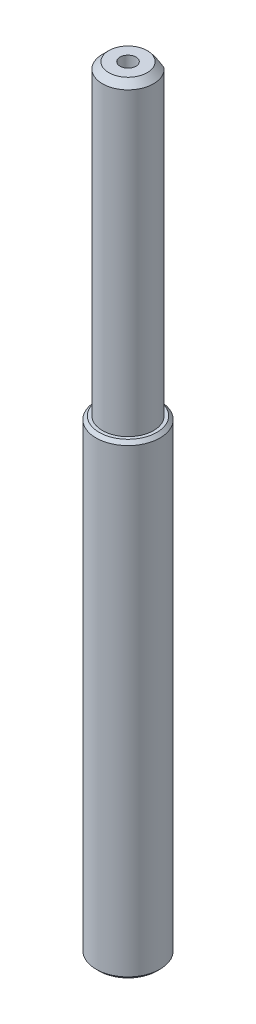
ISO-10303-21;
HEADER;
FILE_DESCRIPTION(('STEP AP214'),'2;1');
FILE_NAME('part.step','',(''),(''),'','','');
FILE_SCHEMA(('AUTOMOTIVE_DESIGN { 1 0 10303 214 1 1 1 1 }'));
ENDSEC;
DATA;
#1=APPLICATION_CONTEXT('core data for automotive mechanical design processes');
#2=APPLICATION_PROTOCOL_DEFINITION('international standard','automotive_design',2000,#1);
#3=PRODUCT_CONTEXT('',#1,'mechanical');
#4=PRODUCT('Part','Part','',(#3));
#5=PRODUCT_RELATED_PRODUCT_CATEGORY('part','',(#4));
#6=PRODUCT_DEFINITION_FORMATION('','',#4);
#7=PRODUCT_DEFINITION_CONTEXT('part definition',#1,'design');
#8=PRODUCT_DEFINITION('design','',#6,#7);
#9=PRODUCT_DEFINITION_SHAPE('','',#8);
#10=(LENGTH_UNIT() NAMED_UNIT(*) SI_UNIT(.MILLI.,.METRE.));
#11=(NAMED_UNIT(*) PLANE_ANGLE_UNIT() SI_UNIT($,.RADIAN.));
#12=(NAMED_UNIT(*) SI_UNIT($,.STERADIAN.) SOLID_ANGLE_UNIT());
#13=UNCERTAINTY_MEASURE_WITH_UNIT(LENGTH_MEASURE(1.E-05),#10,'distance_accuracy_value','');
#14=(GEOMETRIC_REPRESENTATION_CONTEXT(3) GLOBAL_UNCERTAINTY_ASSIGNED_CONTEXT((#13)) GLOBAL_UNIT_ASSIGNED_CONTEXT((#10,
#11,#12)) REPRESENTATION_CONTEXT('',''));
#15=CARTESIAN_POINT('',(0.,0.,0.));
#16=DIRECTION('',(0.,0.,1.));
#17=DIRECTION('',(1.,0.,0.));
#18=AXIS2_PLACEMENT_3D('',#15,#16,#17);
#19=CARTESIAN_POINT('',(0.,24.,0.));
#20=DIRECTION('',(0.,-1.,0.));
#21=DIRECTION('',(0.,0.,-1.));
#22=AXIS2_PLACEMENT_3D('',#19,#20,#21);
#23=CYLINDRICAL_SURFACE('',#22,2.);
#24=CARTESIAN_POINT('',(0.,23.5,0.));
#25=DIRECTION('',(0.,1.,0.));
#26=DIRECTION('',(0.,0.,1.));
#27=AXIS2_PLACEMENT_3D('',#24,#25,#26);
#28=CIRCLE('',#27,2.);
#29=CARTESIAN_POINT('',(1.3228756555323,23.5,-1.5));
#30=VERTEX_POINT('',#29);
#31=CARTESIAN_POINT('',(-1.3228756555323,23.5,-1.5));
#32=VERTEX_POINT('',#31);
#33=EDGE_CURVE('E83',#30,#32,#28,.F.);
#34=ORIENTED_EDGE('',*,*,#33,.T.);
#35=DIRECTION('',(0.,1.,0.));
#36=VECTOR('',#35,1.);
#37=CARTESIAN_POINT('',(-1.3228756555323,9.,-1.5));
#38=LINE('',#37,#36);
#39=CARTESIAN_POINT('',(-1.3228756555323,9.,-1.5));
#40=VERTEX_POINT('',#39);
#41=EDGE_CURVE('E77',#40,#32,#38,.T.);
#42=ORIENTED_EDGE('',*,*,#41,.F.);
#43=CARTESIAN_POINT('',(0.,9.,0.));
#44=DIRECTION('',(0.,1.,0.));
#45=DIRECTION('',(0.,0.,1.));
#46=AXIS2_PLACEMENT_3D('',#43,#44,#45);
#47=CIRCLE('',#46,2.);
#48=CARTESIAN_POINT('',(1.3228756555323,9.,-1.5));
#49=VERTEX_POINT('',#48);
#50=EDGE_CURVE('E68',#49,#40,#47,.T.);
#51=ORIENTED_EDGE('',*,*,#50,.F.);
#52=DIRECTION('',(0.,1.,0.));
#53=VECTOR('',#52,1.);
#54=CARTESIAN_POINT('',(1.3228756555323,9.,-1.5));
#55=LINE('',#54,#53);
#56=EDGE_CURVE('E78',#49,#30,#55,.T.);
#57=ORIENTED_EDGE('',*,*,#56,.T.);
#58=EDGE_LOOP('',(#34,#42,#51,#57));
#59=FACE_BOUND('',#58,.T.);
#60=CARTESIAN_POINT('',(0.,0.,0.));
#61=DIRECTION('',(0.,-1.,0.));
#62=DIRECTION('',(0.,0.,-1.));
#63=AXIS2_PLACEMENT_3D('',#60,#61,#62);
#64=CIRCLE('',#63,2.);
#65=CARTESIAN_POINT('',(0.,0.,-2.));
#66=VERTEX_POINT('',#65);
#67=EDGE_CURVE('E93',#66,#66,#64,.T.);
#68=ORIENTED_EDGE('',*,*,#67,.F.);
#69=EDGE_LOOP('',(#68));
#70=FACE_BOUND('',#69,.T.);
#71=ADVANCED_FACE('F36',(#59,#70),#23,.T.);
#72=CARTESIAN_POINT('',(0.,24.,0.));
#73=DIRECTION('',(0.,1.,0.));
#74=DIRECTION('',(0.,0.,1.));
#75=AXIS2_PLACEMENT_3D('',#72,#73,#74);
#76=PLANE('',#75);
#77=CARTESIAN_POINT('',(0.,24.,0.));
#78=DIRECTION('',(0.,1.,0.));
#79=DIRECTION('',(0.,0.,1.));
#80=AXIS2_PLACEMENT_3D('',#77,#78,#79);
#81=CIRCLE('',#80,0.624999999999995);
#82=CARTESIAN_POINT('',(0.,24.,0.624999999999995));
#83=VERTEX_POINT('',#82);
#84=EDGE_CURVE('E85',#83,#83,#81,.T.);
#85=ORIENTED_EDGE('',*,*,#84,.F.);
#86=EDGE_LOOP('',(#85));
#87=FACE_BOUND('',#86,.T.);
#88=CARTESIAN_POINT('',(0.,24.,0.));
#89=DIRECTION('',(0.,1.,0.));
#90=DIRECTION('',(0.,0.,1.));
#91=AXIS2_PLACEMENT_3D('',#88,#89,#90);
#92=CIRCLE('',#91,1.49999999999999);
#93=CARTESIAN_POINT('',(0.,24.,-1.49999999999999));
#94=VERTEX_POINT('',#93);
#95=EDGE_CURVE('E96',#94,#94,#92,.T.);
#96=ORIENTED_EDGE('',*,*,#95,.T.);
#97=EDGE_LOOP('',(#96));
#98=FACE_BOUND('',#97,.T.);
#99=ADVANCED_FACE('F131',(#87,#98),#76,.T.);
#100=CARTESIAN_POINT('',(0.,0.,0.));
#101=DIRECTION('',(0.,-1.,0.));
#102=DIRECTION('',(0.,0.,-1.));
#103=AXIS2_PLACEMENT_3D('',#100,#101,#102);
#104=PLANE('',#103);
#105=CARTESIAN_POINT('',(0.,0.,0.));
#106=DIRECTION('',(0.,-1.,0.));
#107=DIRECTION('',(0.,0.,-1.));
#108=AXIS2_PLACEMENT_3D('',#105,#106,#107);
#109=CIRCLE('',#108,2.25);
#110=CARTESIAN_POINT('',(0.,0.,-2.25));
#111=VERTEX_POINT('',#110);
#112=EDGE_CURVE('E11',#111,#111,#109,.F.);
#113=ORIENTED_EDGE('',*,*,#112,.T.);
#114=EDGE_LOOP('',(#113));
#115=FACE_BOUND('',#114,.T.);
#116=ORIENTED_EDGE('',*,*,#67,.T.);
#117=EDGE_LOOP('',(#116));
#118=FACE_BOUND('',#117,.T.);
#119=ADVANCED_FACE('F128',(#115,#118),#104,.F.);
#120=CARTESIAN_POINT('',(0.,-36.5,0.));
#121=DIRECTION('',(0.,1.,0.));
#122=DIRECTION('',(0.,0.,1.));
#123=AXIS2_PLACEMENT_3D('',#120,#121,#122);
#124=CYLINDRICAL_SURFACE('',#123,2.5);
#125=CARTESIAN_POINT('',(0.,-36.25,0.));
#126=DIRECTION('',(0.,-1.,0.));
#127=DIRECTION('',(0.,0.,-1.));
#128=AXIS2_PLACEMENT_3D('',#125,#126,#127);
#129=CIRCLE('',#128,2.5);
#130=CARTESIAN_POINT('',(0.,-36.25,-2.5));
#131=VERTEX_POINT('',#130);
#132=EDGE_CURVE('E44',#131,#131,#129,.F.);
#133=ORIENTED_EDGE('',*,*,#132,.T.);
#134=EDGE_LOOP('',(#133));
#135=FACE_BOUND('',#134,.T.);
#136=CARTESIAN_POINT('',(0.,-0.25,0.));
#137=DIRECTION('',(0.,-1.,0.));
#138=DIRECTION('',(0.,0.,-1.));
#139=AXIS2_PLACEMENT_3D('',#136,#137,#138);
#140=CIRCLE('',#139,2.5);
#141=CARTESIAN_POINT('',(0.,-0.25,-2.5));
#142=VERTEX_POINT('',#141);
#143=EDGE_CURVE('E227',#142,#142,#140,.T.);
#144=ORIENTED_EDGE('',*,*,#143,.T.);
#145=EDGE_LOOP('',(#144));
#146=FACE_BOUND('',#145,.T.);
#147=ADVANCED_FACE('F126',(#135,#146),#124,.T.);
#148=CARTESIAN_POINT('',(0.,-36.5,0.));
#149=DIRECTION('',(0.,-1.,0.));
#150=DIRECTION('',(0.,0.,-1.));
#151=AXIS2_PLACEMENT_3D('',#148,#149,#150);
#152=PLANE('',#151);
#153=CARTESIAN_POINT('',(0.,-36.5,0.));
#154=DIRECTION('',(0.,-1.,0.));
#155=DIRECTION('',(0.,0.,-1.));
#156=AXIS2_PLACEMENT_3D('',#153,#154,#155);
#157=CIRCLE('',#156,2.25);
#158=CARTESIAN_POINT('',(0.,-36.5,-2.25));
#159=VERTEX_POINT('',#158);
#160=EDGE_CURVE('E107',#159,#159,#157,.T.);
#161=ORIENTED_EDGE('',*,*,#160,.T.);
#162=EDGE_LOOP('',(#161));
#163=FACE_BOUND('',#162,.T.);
#164=ADVANCED_FACE('F123',(#163),#152,.T.);
#165=CARTESIAN_POINT('',(0.,24.,0.));
#166=DIRECTION('',(0.,-1.,0.));
#167=DIRECTION('',(0.,0.,-1.));
#168=AXIS2_PLACEMENT_3D('',#165,#166,#167);
#169=CONICAL_SURFACE('',#168,1.49999999999999,0.785398163397447);
#170=CARTESIAN_POINT('',(-2.6642770471932,22.4424892176477,-1.5));
#171=CARTESIAN_POINT('',(-2.60054070060768,22.4980177092399,-1.5));
#172=CARTESIAN_POINT('',(-2.53657536633564,22.5532863921102,-1.5));
#173=CARTESIAN_POINT('',(-2.4080636657588,22.6631632147795,-1.5));
#174=CARTESIAN_POINT('',(-2.34351721366277,22.7177712541624,-1.5));
#175=CARTESIAN_POINT('',(-2.21331084345961,22.8265269644548,-1.5));
#176=CARTESIAN_POINT('',(-2.14764638739505,22.8806692149271,-1.5));
#177=CARTESIAN_POINT('',(-2.01547092762352,22.987903519855,-1.5));
#178=CARTESIAN_POINT('',(-1.94895998057567,23.0409956439986,-1.5));
#179=CARTESIAN_POINT('',(-1.80945891275703,23.1500854947049,-1.5));
#180=CARTESIAN_POINT('',(-1.7363802277742,23.2059704093189,-1.5));
#181=CARTESIAN_POINT('',(-1.5886678040126,23.3156432281179,-1.5));
#182=CARTESIAN_POINT('',(-1.51403422178912,23.3694313418693,-1.5));
#183=CARTESIAN_POINT('',(-1.36296725446477,23.4739910405898,-1.5));
#184=CARTESIAN_POINT('',(-1.28653924719604,23.5247703462288,-1.5));
#185=CARTESIAN_POINT('',(-1.13115333225558,23.6222778751019,-1.5));
#186=CARTESIAN_POINT('',(-1.0521967677103,23.669008201758,-1.5));
#187=CARTESIAN_POINT('',(-0.917986877305885,23.7419663871669,-1.5));
#188=CARTESIAN_POINT('',(-0.863626747089197,23.7698282843769,-1.5));
#189=CARTESIAN_POINT('',(-0.75327071731516,23.8221873552792,-1.5));
#190=CARTESIAN_POINT('',(-0.697274384512988,23.8466836278265,-1.5));
#191=CARTESIAN_POINT('',(-0.584280291418382,23.8910499985206,-1.5));
#192=CARTESIAN_POINT('',(-0.527304481697316,23.9109752289865,-1.5));
#193=CARTESIAN_POINT('',(-0.411765243024889,23.9454834665903,-1.5));
#194=CARTESIAN_POINT('',(-0.353203101776472,23.9600706750808,-1.5));
#195=CARTESIAN_POINT('',(-0.249879116218626,23.9799470131828,-1.5));
#196=CARTESIAN_POINT('',(-0.20539057777885,23.9866567921838,-1.5));
#197=CARTESIAN_POINT('',(-0.115998412980082,23.9961771728775,-1.5));
#198=CARTESIAN_POINT('',(-0.0710948720370661,23.9989885597069,-1.5));
#199=CARTESIAN_POINT('',(0.0187537182820963,24.0005548768618,-1.5));
#200=CARTESIAN_POINT('',(0.0636987193458195,23.9993125374645,-1.5));
#201=CARTESIAN_POINT('',(0.153303388396414,23.9928493827827,-1.5));
#202=CARTESIAN_POINT('',(0.197963002173493,23.9876278330388,-1.5));
#203=CARTESIAN_POINT('',(0.298317954065183,23.9716216144772,-1.5));
#204=CARTESIAN_POINT('',(0.353837877250845,23.9597375714252,-1.5));
#205=CARTESIAN_POINT('',(0.463552363728977,23.9309012730658,-1.5));
#206=CARTESIAN_POINT('',(0.517746012205166,23.9139456205253,-1.5));
#207=CARTESIAN_POINT('',(0.625402520612854,23.8756357164569,-1.5));
#208=CARTESIAN_POINT('',(0.678844076452143,23.8542224249907,-1.5));
#209=CARTESIAN_POINT('',(0.784215449177221,23.8080323542498,-1.5));
#210=CARTESIAN_POINT('',(0.836145669027581,23.7832564816987,-1.5));
#211=CARTESIAN_POINT('',(0.977616419331531,23.7112356155506,-1.5));
#212=CARTESIAN_POINT('',(1.06574263978669,23.6612258290453,-1.5));
#213=CARTESIAN_POINT('',(1.2387429735396,23.5558316699111,-1.5));
#214=CARTESIAN_POINT('',(1.32361414908962,23.5004425945076,-1.5));
#215=CARTESIAN_POINT('',(1.49117852040111,23.3857929783673,-1.5));
#216=CARTESIAN_POINT('',(1.57386168523887,23.3265178847449,-1.5));
#217=CARTESIAN_POINT('',(1.73731620619835,23.2053841949126,-1.5));
#218=CARTESIAN_POINT('',(1.81808729002731,23.1435252341698,-1.5));
#219=CARTESIAN_POINT('',(1.97085096895726,23.0236669317796,-1.5));
#220=CARTESIAN_POINT('',(2.042971996357,22.9658305463084,-1.5));
#221=CARTESIAN_POINT('',(2.18625204878543,22.8489658874366,-1.5));
#222=CARTESIAN_POINT('',(2.25741097262821,22.7899374902734,-1.5));
#223=CARTESIAN_POINT('',(2.39828742733591,22.671513283446,-1.5));
#224=CARTESIAN_POINT('',(2.46801221550094,22.6121260851159,-1.5));
#225=CARTESIAN_POINT('',(2.60681731772717,22.4926305120882,-1.5));
#226=CARTESIAN_POINT('',(2.67589775769329,22.4325222837587,-1.5));
#227=CARTESIAN_POINT('',(2.74472988523378,22.3721345708462,-1.5));
#228=B_SPLINE_CURVE_WITH_KNOTS('',3,(#170,#171,#172,#173,#174,#175,#176,#177,#178,#179,#180,
#181,#182,#183,#184,#185,#186,#187,#188,#189,#190,#191,#192,#193,#194,#195,#196,#197,#198,#199,
#200,#201,#202,#203,#204,#205,#206,#207,#208,#209,#210,#211,#212,#213,#214,#215,#216,#217,#218,
#219,#220,#221,#222,#223,#224,#225,#226,#227),.UNSPECIFIED.,.F.,.F.,(4,2,2,2,2,2,2,2,2,2,2,2,2,
2,2,2,2,2,2,2,2,2,2,2,2,2,2,2,4),(0.,0.253599604912685,0.507237283909893,0.762549675607448,
1.01784506714299,1.29381168751122,1.56975065511055,1.84494780991545,2.12000113327563,
2.30316771784342,2.48638325003377,2.66725679545661,2.8479876744863,2.98280853450766,
3.11760223764496,3.25230517288921,3.38703297684164,3.55707210139148,3.72722538322433,
3.8997947882564,4.07231775188512,4.37597173950381,4.67989362423395,4.98502705300462,
5.29020367649701,5.56752989721532,5.84488506136769,6.1196440118975,6.39434810016443),.UNSPECIFIED.);
#229=EDGE_CURVE('E51',#32,#94,#228,.T.);
#230=ORIENTED_EDGE('',*,*,#229,.F.);
#231=ORIENTED_EDGE('',*,*,#33,.F.);
#232=EDGE_CURVE('E100',#94,#30,#228,.T.);
#233=ORIENTED_EDGE('',*,*,#232,.F.);
#234=ORIENTED_EDGE('',*,*,#95,.F.);
#235=EDGE_LOOP('',(#230,#231,#233,#234));
#236=FACE_BOUND('',#235,.T.);
#237=ADVANCED_FACE('F109',(#236),#169,.T.);
#238=CARTESIAN_POINT('',(0.,19.05,0.));
#239=DIRECTION('',(0.,1.,0.));
#240=DIRECTION('',(0.,0.,1.));
#241=AXIS2_PLACEMENT_3D('',#238,#239,#240);
#242=CONICAL_SURFACE('',#241,0.624999999999995,1.02974425867665);
#243=CARTESIAN_POINT('',(0.,18.6744621131078,0.));
#244=VERTEX_POINT('',#243);
#245=VERTEX_LOOP('',#244);
#246=FACE_BOUND('',#245,.T.);
#247=CARTESIAN_POINT('',(0.,19.05,0.));
#248=DIRECTION('',(0.,1.,0.));
#249=DIRECTION('',(0.,0.,1.));
#250=AXIS2_PLACEMENT_3D('',#247,#248,#249);
#251=CIRCLE('',#250,0.624999999999995);
#252=CARTESIAN_POINT('',(0.,19.05,0.624999999999995));
#253=VERTEX_POINT('',#252);
#254=EDGE_CURVE('E90',#253,#253,#251,.T.);
#255=ORIENTED_EDGE('',*,*,#254,.T.);
#256=EDGE_LOOP('',(#255));
#257=FACE_BOUND('',#256,.T.);
#258=ADVANCED_FACE('F119',(#246,#257),#242,.F.);
#259=CARTESIAN_POINT('',(0.,24.,0.));
#260=DIRECTION('',(0.,1.,0.));
#261=DIRECTION('',(0.,0.,1.));
#262=AXIS2_PLACEMENT_3D('',#259,#260,#261);
#263=CYLINDRICAL_SURFACE('',#262,0.624999999999995);
#264=ORIENTED_EDGE('',*,*,#254,.F.);
#265=EDGE_LOOP('',(#264));
#266=FACE_BOUND('',#265,.T.);
#267=ORIENTED_EDGE('',*,*,#84,.T.);
#268=EDGE_LOOP('',(#267));
#269=FACE_BOUND('',#268,.T.);
#270=ADVANCED_FACE('F116',(#266,#269),#263,.F.);
#271=CARTESIAN_POINT('',(-1.3228756555323,9.,-1.5));
#272=DIRECTION('',(0.,0.,1.));
#273=DIRECTION('',(1.,0.,0.));
#274=AXIS2_PLACEMENT_3D('',#271,#272,#273);
#275=PLANE('',#274);
#276=ORIENTED_EDGE('',*,*,#229,.T.);
#277=ORIENTED_EDGE('',*,*,#232,.T.);
#278=ORIENTED_EDGE('',*,*,#56,.F.);
#279=DIRECTION('',(1.,0.,0.));
#280=VECTOR('',#279,1.);
#281=CARTESIAN_POINT('',(-1.3228756555323,9.,-1.5));
#282=LINE('',#281,#280);
#283=EDGE_CURVE('E71',#40,#49,#282,.T.);
#284=ORIENTED_EDGE('',*,*,#283,.F.);
#285=ORIENTED_EDGE('',*,*,#41,.T.);
#286=EDGE_LOOP('',(#276,#277,#278,#284,#285));
#287=FACE_BOUND('',#286,.T.);
#288=ADVANCED_FACE('F76',(#287),#275,.F.);
#289=CARTESIAN_POINT('',(0.,9.,0.));
#290=DIRECTION('',(0.,1.,0.));
#291=DIRECTION('',(0.,0.,1.));
#292=AXIS2_PLACEMENT_3D('',#289,#290,#291);
#293=PLANE('',#292);
#294=ORIENTED_EDGE('',*,*,#50,.T.);
#295=ORIENTED_EDGE('',*,*,#283,.T.);
#296=EDGE_LOOP('',(#294,#295));
#297=FACE_BOUND('',#296,.T.);
#298=ADVANCED_FACE('F70',(#297),#293,.T.);
#299=CARTESIAN_POINT('',(0.,-36.5,0.));
#300=DIRECTION('',(0.,1.,0.));
#301=DIRECTION('',(0.,0.,1.));
#302=AXIS2_PLACEMENT_3D('',#299,#300,#301);
#303=CONICAL_SURFACE('',#302,2.25,0.785398163397458);
#304=ORIENTED_EDGE('',*,*,#132,.F.);
#305=EDGE_LOOP('',(#304));
#306=FACE_BOUND('',#305,.T.);
#307=ORIENTED_EDGE('',*,*,#160,.F.);
#308=EDGE_LOOP('',(#307));
#309=FACE_BOUND('',#308,.T.);
#310=ADVANCED_FACE('F183',(#306,#309),#303,.T.);
#311=CARTESIAN_POINT('',(0.,-0.25,0.));
#312=DIRECTION('',(0.,-1.,0.));
#313=DIRECTION('',(0.,0.,-1.));
#314=AXIS2_PLACEMENT_3D('',#311,#312,#313);
#315=CONICAL_SURFACE('',#314,2.5,0.785398163397458);
#316=ORIENTED_EDGE('',*,*,#112,.F.);
#317=EDGE_LOOP('',(#316));
#318=FACE_BOUND('',#317,.T.);
#319=ORIENTED_EDGE('',*,*,#143,.F.);
#320=EDGE_LOOP('',(#319));
#321=FACE_BOUND('',#320,.T.);
#322=ADVANCED_FACE('F38',(#318,#321),#315,.T.);
#323=CLOSED_SHELL('',(#71,#99,#119,#147,#164,#237,#258,#270,#288,#298,#310,#322));
#324=MANIFOLD_SOLID_BREP('B2',#323);
#325=ADVANCED_BREP_SHAPE_REPRESENTATION('',(#18,#324),#14);
#326=SHAPE_DEFINITION_REPRESENTATION(#9,#325);
ENDSEC;
END-ISO-10303-21;
